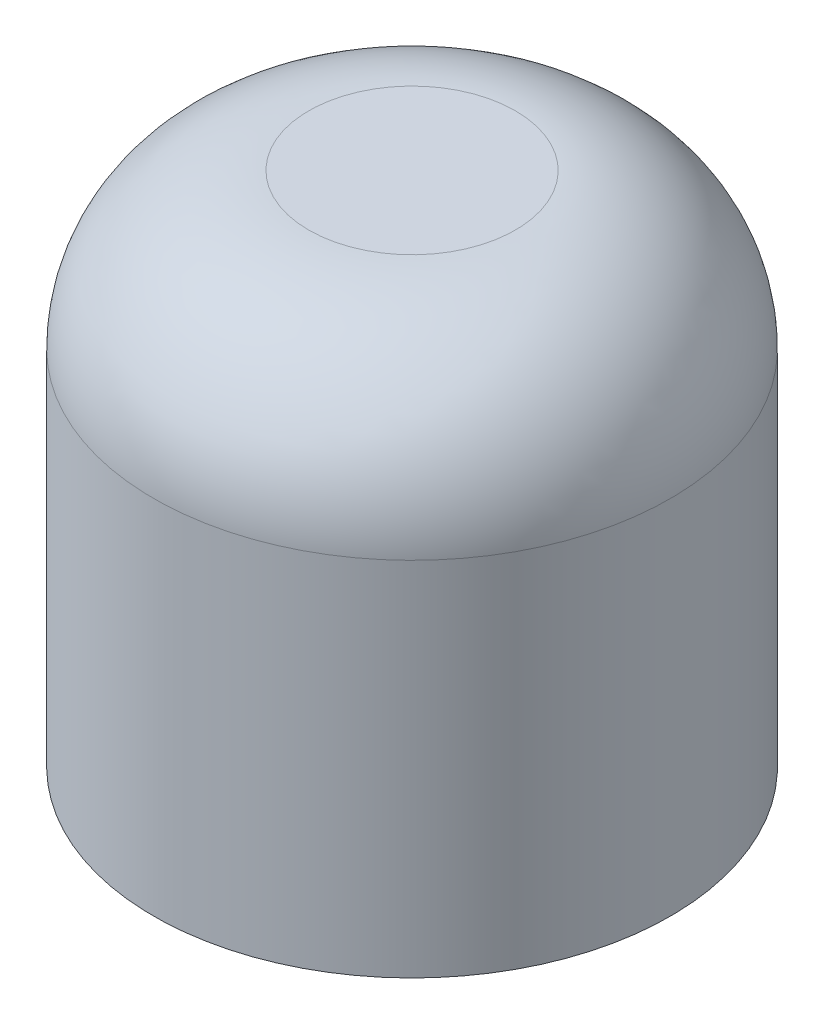
ISO-10303-21;
HEADER;
FILE_DESCRIPTION(('STEP AP214'),'2;1');
FILE_NAME('part.step','',(''),(''),'','','');
FILE_SCHEMA(('AUTOMOTIVE_DESIGN { 1 0 10303 214 1 1 1 1 }'));
ENDSEC;
DATA;
#1=APPLICATION_CONTEXT('core data for automotive mechanical design processes');
#2=APPLICATION_PROTOCOL_DEFINITION('international standard','automotive_design',2000,#1);
#3=PRODUCT_CONTEXT('',#1,'mechanical');
#4=PRODUCT('Part','Part','',(#3));
#5=PRODUCT_RELATED_PRODUCT_CATEGORY('part','',(#4));
#6=PRODUCT_DEFINITION_FORMATION('','',#4);
#7=PRODUCT_DEFINITION_CONTEXT('part definition',#1,'design');
#8=PRODUCT_DEFINITION('design','',#6,#7);
#9=PRODUCT_DEFINITION_SHAPE('','',#8);
#10=(LENGTH_UNIT() NAMED_UNIT(*) SI_UNIT(.MILLI.,.METRE.));
#11=(NAMED_UNIT(*) PLANE_ANGLE_UNIT() SI_UNIT($,.RADIAN.));
#12=(NAMED_UNIT(*) SI_UNIT($,.STERADIAN.) SOLID_ANGLE_UNIT());
#13=UNCERTAINTY_MEASURE_WITH_UNIT(LENGTH_MEASURE(1.E-05),#10,'distance_accuracy_value','');
#14=(GEOMETRIC_REPRESENTATION_CONTEXT(3) GLOBAL_UNCERTAINTY_ASSIGNED_CONTEXT((#13)) GLOBAL_UNIT_ASSIGNED_CONTEXT((#10,
#11,#12)) REPRESENTATION_CONTEXT('',''));
#15=CARTESIAN_POINT('',(0.,0.,0.));
#16=DIRECTION('',(0.,0.,1.));
#17=DIRECTION('',(1.,0.,0.));
#18=AXIS2_PLACEMENT_3D('',#15,#16,#17);
#19=CARTESIAN_POINT('',(-6.35,0.,0.));
#20=DIRECTION('',(0.,1.,0.));
#21=DIRECTION('',(0.,0.,1.));
#22=AXIS2_PLACEMENT_3D('',#19,#20,#21);
#23=PLANE('',#22);
#24=CARTESIAN_POINT('',(0.,0.,0.));
#25=DIRECTION('',(0.,-1.,0.));
#26=DIRECTION('',(0.,0.,-1.));
#27=AXIS2_PLACEMENT_3D('',#24,#25,#26);
#28=CIRCLE('',#27,2.032);
#29=CARTESIAN_POINT('',(0.,0.,-2.032));
#30=VERTEX_POINT('',#29);
#31=EDGE_CURVE('E54',#30,#30,#28,.T.);
#32=ORIENTED_EDGE('',*,*,#31,.F.);
#33=EDGE_LOOP('',(#32));
#34=FACE_BOUND('',#33,.T.);
#35=CARTESIAN_POINT('',(0.,0.,0.));
#36=DIRECTION('',(0.,-1.,0.));
#37=DIRECTION('',(0.,0.,-1.));
#38=AXIS2_PLACEMENT_3D('',#35,#36,#37);
#39=CIRCLE('',#38,6.35);
#40=CARTESIAN_POINT('',(0.,0.,-6.35));
#41=VERTEX_POINT('',#40);
#42=EDGE_CURVE('E48',#41,#41,#39,.T.);
#43=ORIENTED_EDGE('',*,*,#42,.T.);
#44=EDGE_LOOP('',(#43));
#45=FACE_BOUND('',#44,.T.);
#46=ADVANCED_FACE('F40',(#34,#45),#23,.F.);
#47=CARTESIAN_POINT('',(-6.35,12.7,0.));
#48=DIRECTION('',(0.,-1.,0.));
#49=DIRECTION('',(0.,0.,-1.));
#50=AXIS2_PLACEMENT_3D('',#47,#48,#49);
#51=PLANE('',#50);
#52=CARTESIAN_POINT('',(0.,12.7,0.));
#53=DIRECTION('',(0.,-1.,0.));
#54=DIRECTION('',(0.,0.,-1.));
#55=AXIS2_PLACEMENT_3D('',#52,#53,#54);
#56=CIRCLE('',#55,2.54);
#57=CARTESIAN_POINT('',(0.,12.7,-2.54));
#58=VERTEX_POINT('',#57);
#59=EDGE_CURVE('E10',#58,#58,#56,.F.);
#60=ORIENTED_EDGE('',*,*,#59,.T.);
#61=EDGE_LOOP('',(#60));
#62=FACE_BOUND('',#61,.T.);
#63=ADVANCED_FACE('F72',(#62),#51,.F.);
#64=CARTESIAN_POINT('',(0.,-6.58653934333832,0.));
#65=DIRECTION('',(0.,-1.,0.));
#66=DIRECTION('',(0.,0.,-1.));
#67=AXIS2_PLACEMENT_3D('',#64,#65,#66);
#68=CYLINDRICAL_SURFACE('',#67,6.35);
#69=CARTESIAN_POINT('',(0.,8.89,0.));
#70=DIRECTION('',(0.,-1.,0.));
#71=DIRECTION('',(0.,0.,-1.));
#72=AXIS2_PLACEMENT_3D('',#69,#70,#71);
#73=CIRCLE('',#72,6.35);
#74=CARTESIAN_POINT('',(0.,8.89,-6.35));
#75=VERTEX_POINT('',#74);
#76=EDGE_CURVE('E42',#75,#75,#73,.T.);
#77=ORIENTED_EDGE('',*,*,#76,.T.);
#78=EDGE_LOOP('',(#77));
#79=FACE_BOUND('',#78,.T.);
#80=ORIENTED_EDGE('',*,*,#42,.F.);
#81=EDGE_LOOP('',(#80));
#82=FACE_BOUND('',#81,.T.);
#83=ADVANCED_FACE('F74',(#79,#82),#68,.T.);
#84=CARTESIAN_POINT('',(0.,8.89,0.));
#85=DIRECTION('',(0.,-1.,0.));
#86=DIRECTION('',(0.,0.,-1.));
#87=AXIS2_PLACEMENT_3D('',#84,#85,#86);
#88=DEGENERATE_TOROIDAL_SURFACE('',#87,2.54,3.81,.T.);
#89=ORIENTED_EDGE('',*,*,#59,.F.);
#90=EDGE_LOOP('',(#89));
#91=FACE_BOUND('',#90,.T.);
#92=ORIENTED_EDGE('',*,*,#76,.F.);
#93=EDGE_LOOP('',(#92));
#94=FACE_BOUND('',#93,.T.);
#95=ADVANCED_FACE('F39',(#91,#94),#88,.T.);
#96=CARTESIAN_POINT('',(0.,5.08,0.));
#97=DIRECTION('',(0.,-1.,0.));
#98=DIRECTION('',(0.,0.,-1.));
#99=AXIS2_PLACEMENT_3D('',#96,#97,#98);
#100=CYLINDRICAL_SURFACE('',#99,2.032);
#101=CARTESIAN_POINT('',(0.,5.08,0.));
#102=DIRECTION('',(0.,-1.,0.));
#103=DIRECTION('',(0.,0.,-1.));
#104=AXIS2_PLACEMENT_3D('',#101,#102,#103);
#105=CIRCLE('',#104,2.032);
#106=CARTESIAN_POINT('',(0.,5.08,-2.032));
#107=VERTEX_POINT('',#106);
#108=EDGE_CURVE('E55',#107,#107,#105,.T.);
#109=ORIENTED_EDGE('',*,*,#108,.F.);
#110=EDGE_LOOP('',(#109));
#111=FACE_BOUND('',#110,.T.);
#112=ORIENTED_EDGE('',*,*,#31,.T.);
#113=EDGE_LOOP('',(#112));
#114=FACE_BOUND('',#113,.T.);
#115=ADVANCED_FACE('F65',(#111,#114),#100,.F.);
#116=CARTESIAN_POINT('',(0.,5.08,0.));
#117=DIRECTION('',(0.,-1.,0.));
#118=DIRECTION('',(0.,0.,-1.));
#119=AXIS2_PLACEMENT_3D('',#116,#117,#118);
#120=PLANE('',#119);
#121=ORIENTED_EDGE('',*,*,#108,.T.);
#122=EDGE_LOOP('',(#121));
#123=FACE_BOUND('',#122,.T.);
#124=ADVANCED_FACE('F64',(#123),#120,.T.);
#125=CLOSED_SHELL('',(#46,#63,#83,#95,#115,#124));
#126=MANIFOLD_SOLID_BREP('B2',#125);
#127=ADVANCED_BREP_SHAPE_REPRESENTATION('',(#18,#126),#14);
#128=SHAPE_DEFINITION_REPRESENTATION(#9,#127);
ENDSEC;
END-ISO-10303-21;
